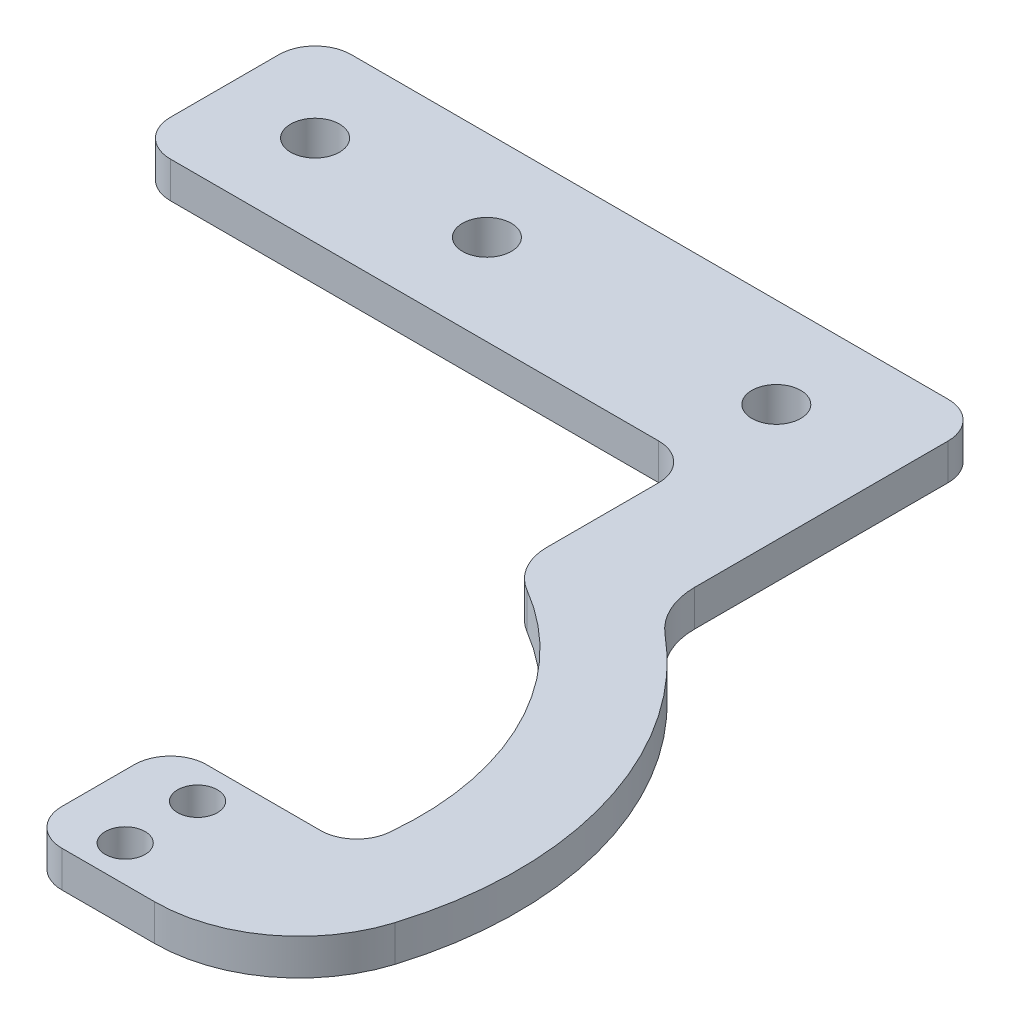
ISO-10303-21;
HEADER;
FILE_DESCRIPTION(('STEP AP214'),'2;1');
FILE_NAME('part.step','',(''),(''),'','','');
FILE_SCHEMA(('AUTOMOTIVE_DESIGN { 1 0 10303 214 1 1 1 1 }'));
ENDSEC;
DATA;
#1=APPLICATION_CONTEXT('core data for automotive mechanical design processes');
#2=APPLICATION_PROTOCOL_DEFINITION('international standard','automotive_design',2000,#1);
#3=PRODUCT_CONTEXT('',#1,'mechanical');
#4=PRODUCT('Part','Part','',(#3));
#5=PRODUCT_RELATED_PRODUCT_CATEGORY('part','',(#4));
#6=PRODUCT_DEFINITION_FORMATION('','',#4);
#7=PRODUCT_DEFINITION_CONTEXT('part definition',#1,'design');
#8=PRODUCT_DEFINITION('design','',#6,#7);
#9=PRODUCT_DEFINITION_SHAPE('','',#8);
#10=(LENGTH_UNIT() NAMED_UNIT(*) SI_UNIT(.MILLI.,.METRE.));
#11=(NAMED_UNIT(*) PLANE_ANGLE_UNIT() SI_UNIT($,.RADIAN.));
#12=(NAMED_UNIT(*) SI_UNIT($,.STERADIAN.) SOLID_ANGLE_UNIT());
#13=UNCERTAINTY_MEASURE_WITH_UNIT(LENGTH_MEASURE(1.E-05),#10,'distance_accuracy_value','');
#14=(GEOMETRIC_REPRESENTATION_CONTEXT(3) GLOBAL_UNCERTAINTY_ASSIGNED_CONTEXT((#13)) GLOBAL_UNIT_ASSIGNED_CONTEXT((#10,
#11,#12)) REPRESENTATION_CONTEXT('',''));
#15=CARTESIAN_POINT('',(0.,0.,0.));
#16=DIRECTION('',(0.,0.,1.));
#17=DIRECTION('',(1.,0.,0.));
#18=AXIS2_PLACEMENT_3D('',#15,#16,#17);
#19=CARTESIAN_POINT('',(0.,2.,0.));
#20=DIRECTION('',(0.,-1.,0.));
#21=DIRECTION('',(0.,0.,-1.));
#22=AXIS2_PLACEMENT_3D('',#19,#20,#21);
#23=PLANE('',#22);
#24=DIRECTION('',(0.,0.,1.));
#25=VECTOR('',#24,1.);
#26=CARTESIAN_POINT('',(-23.5,2.,-5.));
#27=LINE('',#26,#25);
#28=CARTESIAN_POINT('',(-23.5,2.,-3.));
#29=VERTEX_POINT('',#28);
#30=CARTESIAN_POINT('',(-23.5,2.,3.));
#31=VERTEX_POINT('',#30);
#32=EDGE_CURVE('E206',#29,#31,#27,.T.);
#33=ORIENTED_EDGE('',*,*,#32,.T.);
#34=CARTESIAN_POINT('',(-21.5,2.,3.));
#35=DIRECTION('',(0.,-1.,0.));
#36=DIRECTION('',(0.,0.,-1.));
#37=AXIS2_PLACEMENT_3D('',#34,#35,#36);
#38=CIRCLE('',#37,2.);
#39=CARTESIAN_POINT('',(-21.5,2.,5.));
#40=VERTEX_POINT('',#39);
#41=EDGE_CURVE('E266',#31,#40,#38,.F.);
#42=ORIENTED_EDGE('',*,*,#41,.T.);
#43=DIRECTION('',(1.,0.,0.));
#44=VECTOR('',#43,1.);
#45=CARTESIAN_POINT('',(-13.5,2.,5.));
#46=LINE('',#45,#44);
#47=CARTESIAN_POINT('',(5.5,2.,5.));
#48=VERTEX_POINT('',#47);
#49=EDGE_CURVE('E202',#40,#48,#46,.T.);
#50=ORIENTED_EDGE('',*,*,#49,.T.);
#51=CARTESIAN_POINT('',(5.5,2.,7.));
#52=DIRECTION('',(0.,-1.,0.));
#53=DIRECTION('',(0.,0.,-1.));
#54=AXIS2_PLACEMENT_3D('',#51,#52,#53);
#55=CIRCLE('',#54,2.);
#56=CARTESIAN_POINT('',(7.5,2.,7.));
#57=VERTEX_POINT('',#56);
#58=EDGE_CURVE('E44',#48,#57,#55,.T.);
#59=ORIENTED_EDGE('',*,*,#58,.T.);
#60=DIRECTION('',(0.,0.,1.));
#61=VECTOR('',#60,1.);
#62=CARTESIAN_POINT('',(7.5,2.,5.));
#63=LINE('',#62,#61);
#64=CARTESIAN_POINT('',(7.5,2.,13.1825021522129));
#65=VERTEX_POINT('',#64);
#66=EDGE_CURVE('E287',#57,#65,#63,.T.);
#67=ORIENTED_EDGE('',*,*,#66,.T.);
#68=CARTESIAN_POINT('',(10.5,2.,13.1825021522129));
#69=DIRECTION('',(0.,-1.,0.));
#70=DIRECTION('',(0.,0.,-1.));
#71=AXIS2_PLACEMENT_3D('',#68,#69,#70);
#72=CIRCLE('',#71,3.);
#73=CARTESIAN_POINT('',(8.98001923633249,2.,15.7689395626446));
#74=VERTEX_POINT('',#73);
#75=EDGE_CURVE('E201',#65,#74,#72,.F.);
#76=ORIENTED_EDGE('',*,*,#75,.T.);
#77=CARTESIAN_POINT('',(0.873455163439103,2.,29.5632724182805));
#78=DIRECTION('',(0.,-1.,0.));
#79=DIRECTION('',(0.,0.,1.));
#80=AXIS2_PLACEMENT_3D('',#77,#78,#79);
#81=CIRCLE('',#80,16.);
#82=CARTESIAN_POINT('',(16.7889796643267,2.,31.2052467973885));
#83=VERTEX_POINT('',#82);
#84=EDGE_CURVE('E297',#74,#83,#81,.T.);
#85=ORIENTED_EDGE('',*,*,#84,.T.);
#86=CARTESIAN_POINT('',(14.7995391017157,2.,31.));
#87=DIRECTION('',(0.,-1.,0.));
#88=DIRECTION('',(0.,0.,-1.));
#89=AXIS2_PLACEMENT_3D('',#86,#87,#88);
#90=CIRCLE('',#89,2.);
#91=CARTESIAN_POINT('',(14.7995391017157,2.,33.));
#92=VERTEX_POINT('',#91);
#93=EDGE_CURVE('E231',#83,#92,#90,.T.);
#94=ORIENTED_EDGE('',*,*,#93,.T.);
#95=DIRECTION('',(-1.,0.,0.));
#96=VECTOR('',#95,1.);
#97=CARTESIAN_POINT('',(6.5,2.,33.));
#98=LINE('',#97,#96);
#99=CARTESIAN_POINT('',(8.5,2.,33.));
#100=VERTEX_POINT('',#99);
#101=EDGE_CURVE('E367',#92,#100,#98,.T.);
#102=ORIENTED_EDGE('',*,*,#101,.T.);
#103=CARTESIAN_POINT('',(8.5,2.,35.));
#104=DIRECTION('',(0.,-1.,0.));
#105=DIRECTION('',(0.,0.,-1.));
#106=AXIS2_PLACEMENT_3D('',#103,#104,#105);
#107=CIRCLE('',#106,2.);
#108=CARTESIAN_POINT('',(6.5,2.,35.));
#109=VERTEX_POINT('',#108);
#110=EDGE_CURVE('E59',#100,#109,#107,.F.);
#111=ORIENTED_EDGE('',*,*,#110,.T.);
#112=DIRECTION('',(0.,0.,1.));
#113=VECTOR('',#112,1.);
#114=CARTESIAN_POINT('',(6.5,2.,33.));
#115=LINE('',#114,#113);
#116=CARTESIAN_POINT('',(6.5,2.,39.));
#117=VERTEX_POINT('',#116);
#118=EDGE_CURVE('E369',#109,#117,#115,.T.);
#119=ORIENTED_EDGE('',*,*,#118,.T.);
#120=CARTESIAN_POINT('',(8.5,2.,39.));
#121=DIRECTION('',(0.,-1.,0.));
#122=DIRECTION('',(0.,0.,-1.));
#123=AXIS2_PLACEMENT_3D('',#120,#121,#122);
#124=CIRCLE('',#123,2.);
#125=CARTESIAN_POINT('',(8.5,2.,41.));
#126=VERTEX_POINT('',#125);
#127=EDGE_CURVE('E51',#117,#126,#124,.F.);
#128=ORIENTED_EDGE('',*,*,#127,.T.);
#129=DIRECTION('',(1.,0.,0.));
#130=VECTOR('',#129,1.);
#131=CARTESIAN_POINT('',(6.5,2.,41.));
#132=LINE('',#131,#130);
#133=CARTESIAN_POINT('',(13.6262986506319,2.,41.));
#134=VERTEX_POINT('',#133);
#135=EDGE_CURVE('E371',#126,#134,#132,.T.);
#136=ORIENTED_EDGE('',*,*,#135,.T.);
#137=CARTESIAN_POINT('',(13.6262986506319,2.,33.));
#138=DIRECTION('',(0.,-1.,0.));
#139=DIRECTION('',(0.,0.,-1.));
#140=AXIS2_PLACEMENT_3D('',#137,#138,#139);
#141=CIRCLE('',#140,8.);
#142=CARTESIAN_POINT('',(21.2727484536269,2.,35.3519790412071));
#143=VERTEX_POINT('',#142);
#144=EDGE_CURVE('E200',#134,#143,#141,.F.);
#145=ORIENTED_EDGE('',*,*,#144,.T.);
#146=CARTESIAN_POINT('',(2.15662394613932,2.,29.4720314381894));
#147=DIRECTION('',(0.,1.,0.));
#148=DIRECTION('',(0.,0.,1.));
#149=AXIS2_PLACEMENT_3D('',#146,#147,#148);
#150=CIRCLE('',#149,20.);
#151=CARTESIAN_POINT('',(14.9427706576899,2.,14.0930050622869));
#152=VERTEX_POINT('',#151);
#153=EDGE_CURVE('E358',#143,#152,#150,.T.);
#154=ORIENTED_EDGE('',*,*,#153,.T.);
#155=CARTESIAN_POINT('',(17.5,2.,11.0171997871064));
#156=DIRECTION('',(0.,-1.,0.));
#157=DIRECTION('',(0.,0.,-1.));
#158=AXIS2_PLACEMENT_3D('',#155,#156,#157);
#159=CIRCLE('',#158,4.);
#160=CARTESIAN_POINT('',(13.5,2.,11.0171997871064));
#161=VERTEX_POINT('',#160);
#162=EDGE_CURVE('E235',#152,#161,#159,.T.);
#163=ORIENTED_EDGE('',*,*,#162,.T.);
#164=DIRECTION('',(0.,0.,-1.));
#165=VECTOR('',#164,1.);
#166=CARTESIAN_POINT('',(13.5,2.,5.));
#167=LINE('',#166,#165);
#168=CARTESIAN_POINT('',(13.5,2.,-3.));
#169=VERTEX_POINT('',#168);
#170=EDGE_CURVE('E306',#161,#169,#167,.T.);
#171=ORIENTED_EDGE('',*,*,#170,.T.);
#172=CARTESIAN_POINT('',(11.5,2.,-3.));
#173=DIRECTION('',(0.,-1.,0.));
#174=DIRECTION('',(0.,0.,-1.));
#175=AXIS2_PLACEMENT_3D('',#172,#173,#174);
#176=CIRCLE('',#175,2.);
#177=CARTESIAN_POINT('',(11.5,2.,-5.));
#178=VERTEX_POINT('',#177);
#179=EDGE_CURVE('E260',#169,#178,#176,.F.);
#180=ORIENTED_EDGE('',*,*,#179,.T.);
#181=DIRECTION('',(-1.,0.,0.));
#182=VECTOR('',#181,1.);
#183=CARTESIAN_POINT('',(-13.5,2.,-5.));
#184=LINE('',#183,#182);
#185=CARTESIAN_POINT('',(-21.5,2.,-5.));
#186=VERTEX_POINT('',#185);
#187=EDGE_CURVE('E309',#178,#186,#184,.T.);
#188=ORIENTED_EDGE('',*,*,#187,.T.);
#189=CARTESIAN_POINT('',(-21.5,2.,-3.));
#190=DIRECTION('',(0.,-1.,0.));
#191=DIRECTION('',(0.,0.,-1.));
#192=AXIS2_PLACEMENT_3D('',#189,#190,#191);
#193=CIRCLE('',#192,2.);
#194=EDGE_CURVE('E264',#186,#29,#193,.F.);
#195=ORIENTED_EDGE('',*,*,#194,.T.);
#196=EDGE_LOOP('',(#33,#42,#50,#59,#67,#76,#85,#94,#102,#111,#119,#128,#136,#145,#154,#163,#171,
#180,#188,#195));
#197=FACE_BOUND('',#196,.T.);
#198=CARTESIAN_POINT('',(7.,2.,0.));
#199=DIRECTION('',(0.,1.,0.));
#200=DIRECTION('',(0.,0.,1.));
#201=AXIS2_PLACEMENT_3D('',#198,#199,#200);
#202=CIRCLE('',#201,1.35);
#203=CARTESIAN_POINT('',(7.,2.,1.35));
#204=VERTEX_POINT('',#203);
#205=EDGE_CURVE('E321',#204,#204,#202,.T.);
#206=ORIENTED_EDGE('',*,*,#205,.F.);
#207=EDGE_LOOP('',(#206));
#208=FACE_BOUND('',#207,.T.);
#209=CARTESIAN_POINT('',(-9.,2.,0.));
#210=DIRECTION('',(0.,1.,0.));
#211=DIRECTION('',(0.,0.,-1.));
#212=AXIS2_PLACEMENT_3D('',#209,#210,#211);
#213=CIRCLE('',#212,1.35);
#214=CARTESIAN_POINT('',(-9.,2.,-1.35));
#215=VERTEX_POINT('',#214);
#216=EDGE_CURVE('E329',#215,#215,#213,.T.);
#217=ORIENTED_EDGE('',*,*,#216,.F.);
#218=EDGE_LOOP('',(#217));
#219=FACE_BOUND('',#218,.T.);
#220=CARTESIAN_POINT('',(-18.5,2.,0.));
#221=DIRECTION('',(0.,1.,0.));
#222=DIRECTION('',(0.,0.,1.));
#223=AXIS2_PLACEMENT_3D('',#220,#221,#222);
#224=CIRCLE('',#223,1.35);
#225=CARTESIAN_POINT('',(-18.5,2.,1.35));
#226=VERTEX_POINT('',#225);
#227=EDGE_CURVE('E335',#226,#226,#224,.T.);
#228=ORIENTED_EDGE('',*,*,#227,.F.);
#229=EDGE_LOOP('',(#228));
#230=FACE_BOUND('',#229,.T.);
#231=CARTESIAN_POINT('',(10.,2.,35.));
#232=DIRECTION('',(0.,1.,0.));
#233=DIRECTION('',(0.,0.,-1.));
#234=AXIS2_PLACEMENT_3D('',#231,#232,#233);
#235=CIRCLE('',#234,1.1);
#236=CARTESIAN_POINT('',(10.,2.,33.9));
#237=VERTEX_POINT('',#236);
#238=EDGE_CURVE('E298',#237,#237,#235,.T.);
#239=ORIENTED_EDGE('',*,*,#238,.F.);
#240=EDGE_LOOP('',(#239));
#241=FACE_BOUND('',#240,.T.);
#242=CARTESIAN_POINT('',(10.,2.,39.));
#243=DIRECTION('',(0.,1.,0.));
#244=DIRECTION('',(0.,0.,1.));
#245=AXIS2_PLACEMENT_3D('',#242,#243,#244);
#246=CIRCLE('',#245,1.1);
#247=CARTESIAN_POINT('',(10.,2.,40.1));
#248=VERTEX_POINT('',#247);
#249=EDGE_CURVE('E354',#248,#248,#246,.T.);
#250=ORIENTED_EDGE('',*,*,#249,.F.);
#251=EDGE_LOOP('',(#250));
#252=FACE_BOUND('',#251,.T.);
#253=ADVANCED_FACE('F36',(#197,#208,#219,#230,#241,#252),#23,.F.);
#254=CARTESIAN_POINT('',(0.,0.,0.));
#255=DIRECTION('',(0.,-1.,0.));
#256=DIRECTION('',(0.,0.,-1.));
#257=AXIS2_PLACEMENT_3D('',#254,#255,#256);
#258=PLANE('',#257);
#259=CARTESIAN_POINT('',(-9.,0.,0.));
#260=DIRECTION('',(0.,1.,0.));
#261=DIRECTION('',(0.,0.,-1.));
#262=AXIS2_PLACEMENT_3D('',#259,#260,#261);
#263=CIRCLE('',#262,1.35);
#264=CARTESIAN_POINT('',(-9.,0.,-1.35));
#265=VERTEX_POINT('',#264);
#266=EDGE_CURVE('E332',#265,#265,#263,.T.);
#267=ORIENTED_EDGE('',*,*,#266,.T.);
#268=EDGE_LOOP('',(#267));
#269=FACE_BOUND('',#268,.T.);
#270=DIRECTION('',(1.,0.,0.));
#271=VECTOR('',#270,1.);
#272=CARTESIAN_POINT('',(-13.5,0.,5.));
#273=LINE('',#272,#271);
#274=CARTESIAN_POINT('',(-21.5,0.,5.));
#275=VERTEX_POINT('',#274);
#276=CARTESIAN_POINT('',(5.5,0.,5.));
#277=VERTEX_POINT('',#276);
#278=EDGE_CURVE('E209',#275,#277,#273,.T.);
#279=ORIENTED_EDGE('',*,*,#278,.F.);
#280=CARTESIAN_POINT('',(-21.5,0.,3.));
#281=DIRECTION('',(0.,-1.,0.));
#282=DIRECTION('',(0.,0.,-1.));
#283=AXIS2_PLACEMENT_3D('',#280,#281,#282);
#284=CIRCLE('',#283,2.);
#285=CARTESIAN_POINT('',(-23.5,0.,3.));
#286=VERTEX_POINT('',#285);
#287=EDGE_CURVE('E253',#275,#286,#284,.T.);
#288=ORIENTED_EDGE('',*,*,#287,.T.);
#289=DIRECTION('',(0.,0.,1.));
#290=VECTOR('',#289,1.);
#291=CARTESIAN_POINT('',(-23.5,0.,-5.));
#292=LINE('',#291,#290);
#293=CARTESIAN_POINT('',(-23.5,0.,-3.));
#294=VERTEX_POINT('',#293);
#295=EDGE_CURVE('E307',#294,#286,#292,.T.);
#296=ORIENTED_EDGE('',*,*,#295,.F.);
#297=CARTESIAN_POINT('',(-21.5,0.,-3.));
#298=DIRECTION('',(0.,-1.,0.));
#299=DIRECTION('',(0.,0.,-1.));
#300=AXIS2_PLACEMENT_3D('',#297,#298,#299);
#301=CIRCLE('',#300,2.);
#302=CARTESIAN_POINT('',(-21.5,0.,-5.));
#303=VERTEX_POINT('',#302);
#304=EDGE_CURVE('E251',#294,#303,#301,.T.);
#305=ORIENTED_EDGE('',*,*,#304,.T.);
#306=DIRECTION('',(-1.,0.,0.));
#307=VECTOR('',#306,1.);
#308=CARTESIAN_POINT('',(-13.5,0.,-5.));
#309=LINE('',#308,#307);
#310=CARTESIAN_POINT('',(11.5,0.,-5.));
#311=VERTEX_POINT('',#310);
#312=EDGE_CURVE('E312',#311,#303,#309,.T.);
#313=ORIENTED_EDGE('',*,*,#312,.F.);
#314=CARTESIAN_POINT('',(11.5,0.,-3.));
#315=DIRECTION('',(0.,-1.,0.));
#316=DIRECTION('',(0.,0.,-1.));
#317=AXIS2_PLACEMENT_3D('',#314,#315,#316);
#318=CIRCLE('',#317,2.);
#319=CARTESIAN_POINT('',(13.5,0.,-3.));
#320=VERTEX_POINT('',#319);
#321=EDGE_CURVE('E245',#311,#320,#318,.T.);
#322=ORIENTED_EDGE('',*,*,#321,.T.);
#323=DIRECTION('',(0.,0.,-1.));
#324=VECTOR('',#323,1.);
#325=CARTESIAN_POINT('',(13.5,0.,5.));
#326=LINE('',#325,#324);
#327=CARTESIAN_POINT('',(13.5,0.,11.0171997871064));
#328=VERTEX_POINT('',#327);
#329=EDGE_CURVE('E317',#328,#320,#326,.T.);
#330=ORIENTED_EDGE('',*,*,#329,.F.);
#331=CARTESIAN_POINT('',(17.5,0.,11.0171997871064));
#332=DIRECTION('',(0.,-1.,0.));
#333=DIRECTION('',(0.,0.,-1.));
#334=AXIS2_PLACEMENT_3D('',#331,#332,#333);
#335=CIRCLE('',#334,4.);
#336=CARTESIAN_POINT('',(14.9427706576899,0.,14.0930050622869));
#337=VERTEX_POINT('',#336);
#338=EDGE_CURVE('E237',#328,#337,#335,.F.);
#339=ORIENTED_EDGE('',*,*,#338,.T.);
#340=CARTESIAN_POINT('',(2.15662394613932,0.,29.4720314381894));
#341=DIRECTION('',(0.,-1.,0.));
#342=DIRECTION('',(0.,0.,-1.));
#343=AXIS2_PLACEMENT_3D('',#340,#341,#342);
#344=CIRCLE('',#343,20.);
#345=CARTESIAN_POINT('',(21.2727484536269,0.,35.3519790412071));
#346=VERTEX_POINT('',#345);
#347=EDGE_CURVE('E184',#346,#337,#344,.F.);
#348=ORIENTED_EDGE('',*,*,#347,.F.);
#349=CARTESIAN_POINT('',(13.6262986506319,0.,33.));
#350=DIRECTION('',(0.,-1.,0.));
#351=DIRECTION('',(0.,0.,-1.));
#352=AXIS2_PLACEMENT_3D('',#349,#350,#351);
#353=CIRCLE('',#352,8.);
#354=CARTESIAN_POINT('',(13.6262986506319,0.,41.));
#355=VERTEX_POINT('',#354);
#356=EDGE_CURVE('E188',#346,#355,#353,.T.);
#357=ORIENTED_EDGE('',*,*,#356,.T.);
#358=DIRECTION('',(1.,0.,0.));
#359=VECTOR('',#358,1.);
#360=CARTESIAN_POINT('',(6.5,0.,41.));
#361=LINE('',#360,#359);
#362=CARTESIAN_POINT('',(8.5,0.,41.));
#363=VERTEX_POINT('',#362);
#364=EDGE_CURVE('E174',#363,#355,#361,.T.);
#365=ORIENTED_EDGE('',*,*,#364,.F.);
#366=CARTESIAN_POINT('',(8.5,0.,39.));
#367=DIRECTION('',(0.,-1.,0.));
#368=DIRECTION('',(0.,0.,-1.));
#369=AXIS2_PLACEMENT_3D('',#366,#367,#368);
#370=CIRCLE('',#369,2.);
#371=CARTESIAN_POINT('',(6.5,0.,39.));
#372=VERTEX_POINT('',#371);
#373=EDGE_CURVE('E247',#363,#372,#370,.T.);
#374=ORIENTED_EDGE('',*,*,#373,.T.);
#375=DIRECTION('',(0.,0.,1.));
#376=VECTOR('',#375,1.);
#377=CARTESIAN_POINT('',(6.5,0.,33.));
#378=LINE('',#377,#376);
#379=CARTESIAN_POINT('',(6.5,0.,35.));
#380=VERTEX_POINT('',#379);
#381=EDGE_CURVE('E183',#380,#372,#378,.T.);
#382=ORIENTED_EDGE('',*,*,#381,.F.);
#383=CARTESIAN_POINT('',(8.5,0.,35.));
#384=DIRECTION('',(0.,-1.,0.));
#385=DIRECTION('',(0.,0.,-1.));
#386=AXIS2_PLACEMENT_3D('',#383,#384,#385);
#387=CIRCLE('',#386,2.);
#388=CARTESIAN_POINT('',(8.5,0.,33.));
#389=VERTEX_POINT('',#388);
#390=EDGE_CURVE('E249',#380,#389,#387,.T.);
#391=ORIENTED_EDGE('',*,*,#390,.T.);
#392=DIRECTION('',(-1.,0.,0.));
#393=VECTOR('',#392,1.);
#394=CARTESIAN_POINT('',(6.5,0.,33.));
#395=LINE('',#394,#393);
#396=CARTESIAN_POINT('',(14.7995391017157,0.,33.));
#397=VERTEX_POINT('',#396);
#398=EDGE_CURVE('E347',#397,#389,#395,.T.);
#399=ORIENTED_EDGE('',*,*,#398,.F.);
#400=CARTESIAN_POINT('',(14.7995391017157,0.,31.));
#401=DIRECTION('',(0.,-1.,0.));
#402=DIRECTION('',(0.,0.,-1.));
#403=AXIS2_PLACEMENT_3D('',#400,#401,#402);
#404=CIRCLE('',#403,2.);
#405=CARTESIAN_POINT('',(16.7889796643267,0.,31.2052467973885));
#406=VERTEX_POINT('',#405);
#407=EDGE_CURVE('E233',#397,#406,#404,.F.);
#408=ORIENTED_EDGE('',*,*,#407,.T.);
#409=CARTESIAN_POINT('',(0.873455163439103,0.,29.5632724182805));
#410=DIRECTION('',(0.,-1.,0.));
#411=DIRECTION('',(0.,0.,-1.));
#412=AXIS2_PLACEMENT_3D('',#409,#410,#411);
#413=CIRCLE('',#412,16.);
#414=CARTESIAN_POINT('',(8.98001923633249,0.,15.7689395626446));
#415=VERTEX_POINT('',#414);
#416=EDGE_CURVE('E344',#415,#406,#413,.T.);
#417=ORIENTED_EDGE('',*,*,#416,.F.);
#418=CARTESIAN_POINT('',(10.5,0.,13.1825021522129));
#419=DIRECTION('',(0.,-1.,0.));
#420=DIRECTION('',(0.,0.,-1.));
#421=AXIS2_PLACEMENT_3D('',#418,#419,#420);
#422=CIRCLE('',#421,3.);
#423=CARTESIAN_POINT('',(7.5,0.,13.1825021522129));
#424=VERTEX_POINT('',#423);
#425=EDGE_CURVE('E196',#415,#424,#422,.T.);
#426=ORIENTED_EDGE('',*,*,#425,.T.);
#427=DIRECTION('',(0.,0.,1.));
#428=VECTOR('',#427,1.);
#429=CARTESIAN_POINT('',(7.5,0.,5.));
#430=LINE('',#429,#428);
#431=CARTESIAN_POINT('',(7.5,0.,7.));
#432=VERTEX_POINT('',#431);
#433=EDGE_CURVE('E302',#432,#424,#430,.T.);
#434=ORIENTED_EDGE('',*,*,#433,.F.);
#435=CARTESIAN_POINT('',(5.5,0.,7.));
#436=DIRECTION('',(0.,-1.,0.));
#437=DIRECTION('',(0.,0.,-1.));
#438=AXIS2_PLACEMENT_3D('',#435,#436,#437);
#439=CIRCLE('',#438,2.);
#440=EDGE_CURVE('E12',#432,#277,#439,.F.);
#441=ORIENTED_EDGE('',*,*,#440,.T.);
#442=EDGE_LOOP('',(#279,#288,#296,#305,#313,#322,#330,#339,#348,#357,#365,#374,#382,#391,#399,
#408,#417,#426,#434,#441));
#443=FACE_BOUND('',#442,.T.);
#444=CARTESIAN_POINT('',(7.,0.,0.));
#445=DIRECTION('',(0.,1.,0.));
#446=DIRECTION('',(0.,0.,1.));
#447=AXIS2_PLACEMENT_3D('',#444,#445,#446);
#448=CIRCLE('',#447,1.35);
#449=CARTESIAN_POINT('',(7.,0.,1.35));
#450=VERTEX_POINT('',#449);
#451=EDGE_CURVE('E326',#450,#450,#448,.T.);
#452=ORIENTED_EDGE('',*,*,#451,.T.);
#453=EDGE_LOOP('',(#452));
#454=FACE_BOUND('',#453,.T.);
#455=CARTESIAN_POINT('',(-18.5,0.,0.));
#456=DIRECTION('',(0.,1.,0.));
#457=DIRECTION('',(0.,0.,1.));
#458=AXIS2_PLACEMENT_3D('',#455,#456,#457);
#459=CIRCLE('',#458,1.35);
#460=CARTESIAN_POINT('',(-18.5,0.,1.35));
#461=VERTEX_POINT('',#460);
#462=EDGE_CURVE('E338',#461,#461,#459,.T.);
#463=ORIENTED_EDGE('',*,*,#462,.T.);
#464=EDGE_LOOP('',(#463));
#465=FACE_BOUND('',#464,.T.);
#466=CARTESIAN_POINT('',(10.,0.,35.));
#467=DIRECTION('',(0.,-1.,0.));
#468=DIRECTION('',(0.,0.,-1.));
#469=AXIS2_PLACEMENT_3D('',#466,#467,#468);
#470=CIRCLE('',#469,1.1);
#471=CARTESIAN_POINT('',(10.,0.,33.9));
#472=VERTEX_POINT('',#471);
#473=EDGE_CURVE('E355',#472,#472,#470,.F.);
#474=ORIENTED_EDGE('',*,*,#473,.T.);
#475=EDGE_LOOP('',(#474));
#476=FACE_BOUND('',#475,.T.);
#477=CARTESIAN_POINT('',(10.,0.,39.));
#478=DIRECTION('',(0.,-1.,0.));
#479=DIRECTION('',(0.,0.,-1.));
#480=AXIS2_PLACEMENT_3D('',#477,#478,#479);
#481=CIRCLE('',#480,1.1);
#482=CARTESIAN_POINT('',(10.,0.,37.9));
#483=VERTEX_POINT('',#482);
#484=EDGE_CURVE('E341',#483,#483,#481,.F.);
#485=ORIENTED_EDGE('',*,*,#484,.T.);
#486=EDGE_LOOP('',(#485));
#487=FACE_BOUND('',#486,.T.);
#488=ADVANCED_FACE('F190',(#269,#443,#454,#465,#476,#487),#258,.T.);
#489=CARTESIAN_POINT('',(13.5,2.,5.));
#490=DIRECTION('',(-1.,0.,0.));
#491=DIRECTION('',(0.,0.,1.));
#492=AXIS2_PLACEMENT_3D('',#489,#490,#491);
#493=PLANE('',#492);
#494=ORIENTED_EDGE('',*,*,#329,.T.);
#495=DIRECTION('',(0.,-1.,0.));
#496=VECTOR('',#495,1.);
#497=CARTESIAN_POINT('',(13.5,2.,-3.));
#498=LINE('',#497,#496);
#499=EDGE_CURVE('E281',#320,#169,#498,.F.);
#500=ORIENTED_EDGE('',*,*,#499,.T.);
#501=ORIENTED_EDGE('',*,*,#170,.F.);
#502=DIRECTION('',(0.,1.,0.));
#503=VECTOR('',#502,1.);
#504=CARTESIAN_POINT('',(13.5,2.,11.0171997871064));
#505=LINE('',#504,#503);
#506=EDGE_CURVE('E226',#161,#328,#505,.F.);
#507=ORIENTED_EDGE('',*,*,#506,.T.);
#508=EDGE_LOOP('',(#494,#500,#501,#507));
#509=FACE_BOUND('',#508,.T.);
#510=ADVANCED_FACE('F385',(#509),#493,.F.);
#511=CARTESIAN_POINT('',(-13.5,2.,-5.));
#512=DIRECTION('',(0.,0.,1.));
#513=DIRECTION('',(1.,0.,0.));
#514=AXIS2_PLACEMENT_3D('',#511,#512,#513);
#515=PLANE('',#514);
#516=ORIENTED_EDGE('',*,*,#312,.T.);
#517=DIRECTION('',(0.,-1.,0.));
#518=VECTOR('',#517,1.);
#519=CARTESIAN_POINT('',(-21.5,2.,-5.));
#520=LINE('',#519,#518);
#521=EDGE_CURVE('E271',#303,#186,#520,.F.);
#522=ORIENTED_EDGE('',*,*,#521,.T.);
#523=ORIENTED_EDGE('',*,*,#187,.F.);
#524=DIRECTION('',(0.,-1.,0.));
#525=VECTOR('',#524,1.);
#526=CARTESIAN_POINT('',(11.5,2.,-5.));
#527=LINE('',#526,#525);
#528=EDGE_CURVE('E268',#178,#311,#527,.T.);
#529=ORIENTED_EDGE('',*,*,#528,.T.);
#530=EDGE_LOOP('',(#516,#522,#523,#529));
#531=FACE_BOUND('',#530,.T.);
#532=ADVANCED_FACE('F394',(#531),#515,.F.);
#533=CARTESIAN_POINT('',(-23.5,2.,-5.));
#534=DIRECTION('',(1.,0.,0.));
#535=DIRECTION('',(0.,0.,-1.));
#536=AXIS2_PLACEMENT_3D('',#533,#534,#535);
#537=PLANE('',#536);
#538=ORIENTED_EDGE('',*,*,#295,.T.);
#539=DIRECTION('',(0.,-1.,0.));
#540=VECTOR('',#539,1.);
#541=CARTESIAN_POINT('',(-23.5,2.,3.));
#542=LINE('',#541,#540);
#543=EDGE_CURVE('E258',#286,#31,#542,.F.);
#544=ORIENTED_EDGE('',*,*,#543,.T.);
#545=ORIENTED_EDGE('',*,*,#32,.F.);
#546=DIRECTION('',(0.,-1.,0.));
#547=VECTOR('',#546,1.);
#548=CARTESIAN_POINT('',(-23.5,2.,-3.));
#549=LINE('',#548,#547);
#550=EDGE_CURVE('E255',#29,#294,#549,.T.);
#551=ORIENTED_EDGE('',*,*,#550,.T.);
#552=EDGE_LOOP('',(#538,#544,#545,#551));
#553=FACE_BOUND('',#552,.T.);
#554=ADVANCED_FACE('F401',(#553),#537,.F.);
#555=CARTESIAN_POINT('',(-13.5,2.,5.));
#556=DIRECTION('',(0.,0.,-1.));
#557=DIRECTION('',(-1.,0.,0.));
#558=AXIS2_PLACEMENT_3D('',#555,#556,#557);
#559=PLANE('',#558);
#560=ORIENTED_EDGE('',*,*,#49,.F.);
#561=DIRECTION('',(0.,-1.,0.));
#562=VECTOR('',#561,1.);
#563=CARTESIAN_POINT('',(-21.5,2.,5.));
#564=LINE('',#563,#562);
#565=EDGE_CURVE('E242',#40,#275,#564,.T.);
#566=ORIENTED_EDGE('',*,*,#565,.T.);
#567=ORIENTED_EDGE('',*,*,#278,.T.);
#568=DIRECTION('',(0.,1.,0.));
#569=VECTOR('',#568,1.);
#570=CARTESIAN_POINT('',(5.5,2.,5.));
#571=LINE('',#570,#569);
#572=EDGE_CURVE('E239',#277,#48,#571,.T.);
#573=ORIENTED_EDGE('',*,*,#572,.T.);
#574=EDGE_LOOP('',(#560,#566,#567,#573));
#575=FACE_BOUND('',#574,.T.);
#576=ADVANCED_FACE('F304',(#575),#559,.F.);
#577=CARTESIAN_POINT('',(7.,2.,0.));
#578=DIRECTION('',(0.,-1.,0.));
#579=DIRECTION('',(0.,0.,-1.));
#580=AXIS2_PLACEMENT_3D('',#577,#578,#579);
#581=CYLINDRICAL_SURFACE('',#580,1.35);
#582=ORIENTED_EDGE('',*,*,#205,.T.);
#583=EDGE_LOOP('',(#582));
#584=FACE_BOUND('',#583,.T.);
#585=ORIENTED_EDGE('',*,*,#451,.F.);
#586=EDGE_LOOP('',(#585));
#587=FACE_BOUND('',#586,.T.);
#588=ADVANCED_FACE('F424',(#584,#587),#581,.F.);
#589=CARTESIAN_POINT('',(-9.,2.,0.));
#590=DIRECTION('',(0.,-1.,0.));
#591=DIRECTION('',(0.,0.,-1.));
#592=AXIS2_PLACEMENT_3D('',#589,#590,#591);
#593=CYLINDRICAL_SURFACE('',#592,1.35);
#594=ORIENTED_EDGE('',*,*,#216,.T.);
#595=EDGE_LOOP('',(#594));
#596=FACE_BOUND('',#595,.T.);
#597=ORIENTED_EDGE('',*,*,#266,.F.);
#598=EDGE_LOOP('',(#597));
#599=FACE_BOUND('',#598,.T.);
#600=ADVANCED_FACE('F608',(#596,#599),#593,.F.);
#601=CARTESIAN_POINT('',(-18.5,2.,0.));
#602=DIRECTION('',(0.,-1.,0.));
#603=DIRECTION('',(0.,0.,-1.));
#604=AXIS2_PLACEMENT_3D('',#601,#602,#603);
#605=CYLINDRICAL_SURFACE('',#604,1.35);
#606=ORIENTED_EDGE('',*,*,#227,.T.);
#607=EDGE_LOOP('',(#606));
#608=FACE_BOUND('',#607,.T.);
#609=ORIENTED_EDGE('',*,*,#462,.F.);
#610=EDGE_LOOP('',(#609));
#611=FACE_BOUND('',#610,.T.);
#612=ADVANCED_FACE('F601',(#608,#611),#605,.F.);
#613=CARTESIAN_POINT('',(2.15662394613932,-39.2572270211591,29.4720314381894));
#614=DIRECTION('',(0.,1.,0.));
#615=DIRECTION('',(0.,0.,1.));
#616=AXIS2_PLACEMENT_3D('',#613,#614,#615);
#617=CYLINDRICAL_SURFACE('',#616,20.);
#618=ORIENTED_EDGE('',*,*,#153,.F.);
#619=DIRECTION('',(0.,1.,0.));
#620=VECTOR('',#619,1.);
#621=CARTESIAN_POINT('',(21.2727484536269,-39.2572270211591,35.3519790412071));
#622=LINE('',#621,#620);
#623=EDGE_CURVE('E216',#143,#346,#622,.F.);
#624=ORIENTED_EDGE('',*,*,#623,.T.);
#625=ORIENTED_EDGE('',*,*,#347,.T.);
#626=DIRECTION('',(0.,1.,0.));
#627=VECTOR('',#626,1.);
#628=CARTESIAN_POINT('',(14.9427706576899,-39.2572270211591,14.0930050622869));
#629=LINE('',#628,#627);
#630=EDGE_CURVE('E213',#337,#152,#629,.T.);
#631=ORIENTED_EDGE('',*,*,#630,.T.);
#632=EDGE_LOOP('',(#618,#624,#625,#631));
#633=FACE_BOUND('',#632,.T.);
#634=ADVANCED_FACE('F377',(#633),#617,.T.);
#635=CARTESIAN_POINT('',(6.5,-39.2572270211591,41.));
#636=DIRECTION('',(0.,0.,1.));
#637=DIRECTION('',(1.,0.,0.));
#638=AXIS2_PLACEMENT_3D('',#635,#636,#637);
#639=PLANE('',#638);
#640=ORIENTED_EDGE('',*,*,#135,.F.);
#641=DIRECTION('',(0.,1.,0.));
#642=VECTOR('',#641,1.);
#643=CARTESIAN_POINT('',(8.5,-39.2572270211591,41.));
#644=LINE('',#643,#642);
#645=EDGE_CURVE('E180',#126,#363,#644,.F.);
#646=ORIENTED_EDGE('',*,*,#645,.T.);
#647=ORIENTED_EDGE('',*,*,#364,.T.);
#648=DIRECTION('',(0.,1.,0.));
#649=VECTOR('',#648,1.);
#650=CARTESIAN_POINT('',(13.6262986506319,-39.2572270211591,41.));
#651=LINE('',#650,#649);
#652=EDGE_CURVE('E179',#355,#134,#651,.T.);
#653=ORIENTED_EDGE('',*,*,#652,.T.);
#654=EDGE_LOOP('',(#640,#646,#647,#653));
#655=FACE_BOUND('',#654,.T.);
#656=ADVANCED_FACE('F177',(#655),#639,.T.);
#657=CARTESIAN_POINT('',(6.5,-39.2572270211591,33.));
#658=DIRECTION('',(-1.,0.,0.));
#659=DIRECTION('',(0.,0.,1.));
#660=AXIS2_PLACEMENT_3D('',#657,#658,#659);
#661=PLANE('',#660);
#662=ORIENTED_EDGE('',*,*,#118,.F.);
#663=DIRECTION('',(0.,1.,0.));
#664=VECTOR('',#663,1.);
#665=CARTESIAN_POINT('',(6.5,-39.2572270211591,35.));
#666=LINE('',#665,#664);
#667=EDGE_CURVE('E278',#109,#380,#666,.F.);
#668=ORIENTED_EDGE('',*,*,#667,.T.);
#669=ORIENTED_EDGE('',*,*,#381,.T.);
#670=DIRECTION('',(0.,1.,0.));
#671=VECTOR('',#670,1.);
#672=CARTESIAN_POINT('',(6.5,-39.2572270211591,39.));
#673=LINE('',#672,#671);
#674=EDGE_CURVE('E276',#372,#117,#673,.T.);
#675=ORIENTED_EDGE('',*,*,#674,.T.);
#676=EDGE_LOOP('',(#662,#668,#669,#675));
#677=FACE_BOUND('',#676,.T.);
#678=ADVANCED_FACE('F503',(#677),#661,.T.);
#679=CARTESIAN_POINT('',(6.5,-39.2572270211591,33.));
#680=DIRECTION('',(0.,0.,-1.));
#681=DIRECTION('',(-1.,0.,0.));
#682=AXIS2_PLACEMENT_3D('',#679,#680,#681);
#683=PLANE('',#682);
#684=ORIENTED_EDGE('',*,*,#398,.T.);
#685=DIRECTION('',(0.,1.,0.));
#686=VECTOR('',#685,1.);
#687=CARTESIAN_POINT('',(8.5,-39.2572270211591,33.));
#688=LINE('',#687,#686);
#689=EDGE_CURVE('E273',#389,#100,#688,.T.);
#690=ORIENTED_EDGE('',*,*,#689,.T.);
#691=ORIENTED_EDGE('',*,*,#101,.F.);
#692=DIRECTION('',(0.,-1.,0.));
#693=VECTOR('',#692,1.);
#694=CARTESIAN_POINT('',(14.7995391017157,0.,33.));
#695=LINE('',#694,#693);
#696=EDGE_CURVE('E224',#92,#397,#695,.T.);
#697=ORIENTED_EDGE('',*,*,#696,.T.);
#698=EDGE_LOOP('',(#684,#690,#691,#697));
#699=FACE_BOUND('',#698,.T.);
#700=ADVANCED_FACE('F513',(#699),#683,.T.);
#701=CARTESIAN_POINT('',(0.873455163439103,-39.2572270211591,29.5632724182805));
#702=DIRECTION('',(0.,1.,0.));
#703=DIRECTION('',(0.,0.,1.));
#704=AXIS2_PLACEMENT_3D('',#701,#702,#703);
#705=CYLINDRICAL_SURFACE('',#704,16.);
#706=ORIENTED_EDGE('',*,*,#416,.T.);
#707=DIRECTION('',(0.,1.,0.));
#708=VECTOR('',#707,1.);
#709=CARTESIAN_POINT('',(16.7889796643267,-39.2572270211591,31.2052467973885));
#710=LINE('',#709,#708);
#711=EDGE_CURVE('E221',#406,#83,#710,.T.);
#712=ORIENTED_EDGE('',*,*,#711,.T.);
#713=ORIENTED_EDGE('',*,*,#84,.F.);
#714=DIRECTION('',(0.,1.,0.));
#715=VECTOR('',#714,1.);
#716=CARTESIAN_POINT('',(8.98001923633249,-39.2572270211591,15.7689395626446));
#717=LINE('',#716,#715);
#718=EDGE_CURVE('E195',#74,#415,#717,.F.);
#719=ORIENTED_EDGE('',*,*,#718,.T.);
#720=EDGE_LOOP('',(#706,#712,#713,#719));
#721=FACE_BOUND('',#720,.T.);
#722=ADVANCED_FACE('F523',(#721),#705,.F.);
#723=CARTESIAN_POINT('',(7.5,-39.2572270211591,5.));
#724=DIRECTION('',(-1.,0.,0.));
#725=DIRECTION('',(0.,0.,1.));
#726=AXIS2_PLACEMENT_3D('',#723,#724,#725);
#727=PLANE('',#726);
#728=ORIENTED_EDGE('',*,*,#66,.F.);
#729=DIRECTION('',(0.,1.,0.));
#730=VECTOR('',#729,1.);
#731=CARTESIAN_POINT('',(7.5,-39.2572270211591,7.));
#732=LINE('',#731,#730);
#733=EDGE_CURVE('E283',#57,#432,#732,.F.);
#734=ORIENTED_EDGE('',*,*,#733,.T.);
#735=ORIENTED_EDGE('',*,*,#433,.T.);
#736=DIRECTION('',(0.,1.,0.));
#737=VECTOR('',#736,1.);
#738=CARTESIAN_POINT('',(7.5,-39.2572270211591,13.1825021522129));
#739=LINE('',#738,#737);
#740=EDGE_CURVE('E228',#424,#65,#739,.T.);
#741=ORIENTED_EDGE('',*,*,#740,.T.);
#742=EDGE_LOOP('',(#728,#734,#735,#741));
#743=FACE_BOUND('',#742,.T.);
#744=ADVANCED_FACE('F294',(#743),#727,.T.);
#745=CARTESIAN_POINT('',(10.,-39.2572270211591,39.));
#746=DIRECTION('',(0.,1.,0.));
#747=DIRECTION('',(0.,0.,1.));
#748=AXIS2_PLACEMENT_3D('',#745,#746,#747);
#749=CYLINDRICAL_SURFACE('',#748,1.1);
#750=ORIENTED_EDGE('',*,*,#249,.T.);
#751=EDGE_LOOP('',(#750));
#752=FACE_BOUND('',#751,.T.);
#753=ORIENTED_EDGE('',*,*,#484,.F.);
#754=EDGE_LOOP('',(#753));
#755=FACE_BOUND('',#754,.T.);
#756=ADVANCED_FACE('F534',(#752,#755),#749,.F.);
#757=CARTESIAN_POINT('',(10.,-39.2572270211591,35.));
#758=DIRECTION('',(0.,1.,0.));
#759=DIRECTION('',(0.,0.,1.));
#760=AXIS2_PLACEMENT_3D('',#757,#758,#759);
#761=CYLINDRICAL_SURFACE('',#760,1.1);
#762=ORIENTED_EDGE('',*,*,#238,.T.);
#763=EDGE_LOOP('',(#762));
#764=FACE_BOUND('',#763,.T.);
#765=ORIENTED_EDGE('',*,*,#473,.F.);
#766=EDGE_LOOP('',(#765));
#767=FACE_BOUND('',#766,.T.);
#768=ADVANCED_FACE('F438',(#764,#767),#761,.F.);
#769=CARTESIAN_POINT('',(13.6262986506319,-39.2572270211591,33.));
#770=DIRECTION('',(0.,1.,0.));
#771=DIRECTION('',(0.,0.,1.));
#772=AXIS2_PLACEMENT_3D('',#769,#770,#771);
#773=CYLINDRICAL_SURFACE('',#772,8.);
#774=ORIENTED_EDGE('',*,*,#356,.F.);
#775=ORIENTED_EDGE('',*,*,#623,.F.);
#776=ORIENTED_EDGE('',*,*,#144,.F.);
#777=ORIENTED_EDGE('',*,*,#652,.F.);
#778=EDGE_LOOP('',(#774,#775,#776,#777));
#779=FACE_BOUND('',#778,.T.);
#780=ADVANCED_FACE('F199',(#779),#773,.T.);
#781=CARTESIAN_POINT('',(14.7995391017157,-39.2572270211591,31.));
#782=DIRECTION('',(0.,1.,0.));
#783=DIRECTION('',(0.,0.,1.));
#784=AXIS2_PLACEMENT_3D('',#781,#782,#783);
#785=CYLINDRICAL_SURFACE('',#784,2.);
#786=ORIENTED_EDGE('',*,*,#407,.F.);
#787=ORIENTED_EDGE('',*,*,#696,.F.);
#788=ORIENTED_EDGE('',*,*,#93,.F.);
#789=ORIENTED_EDGE('',*,*,#711,.F.);
#790=EDGE_LOOP('',(#786,#787,#788,#789));
#791=FACE_BOUND('',#790,.T.);
#792=ADVANCED_FACE('F437',(#791),#785,.F.);
#793=CARTESIAN_POINT('',(17.5,-39.2572270211591,11.0171997871064));
#794=DIRECTION('',(0.,1.,0.));
#795=DIRECTION('',(0.,0.,1.));
#796=AXIS2_PLACEMENT_3D('',#793,#794,#795);
#797=CYLINDRICAL_SURFACE('',#796,4.);
#798=ORIENTED_EDGE('',*,*,#338,.F.);
#799=ORIENTED_EDGE('',*,*,#506,.F.);
#800=ORIENTED_EDGE('',*,*,#162,.F.);
#801=ORIENTED_EDGE('',*,*,#630,.F.);
#802=EDGE_LOOP('',(#798,#799,#800,#801));
#803=FACE_BOUND('',#802,.T.);
#804=ADVANCED_FACE('F381',(#803),#797,.F.);
#805=CARTESIAN_POINT('',(10.5,-39.2572270211591,13.1825021522129));
#806=DIRECTION('',(0.,1.,0.));
#807=DIRECTION('',(0.,0.,1.));
#808=AXIS2_PLACEMENT_3D('',#805,#806,#807);
#809=CYLINDRICAL_SURFACE('',#808,3.);
#810=ORIENTED_EDGE('',*,*,#425,.F.);
#811=ORIENTED_EDGE('',*,*,#718,.F.);
#812=ORIENTED_EDGE('',*,*,#75,.F.);
#813=ORIENTED_EDGE('',*,*,#740,.F.);
#814=EDGE_LOOP('',(#810,#811,#812,#813));
#815=FACE_BOUND('',#814,.T.);
#816=ADVANCED_FACE('F406',(#815),#809,.T.);
#817=CARTESIAN_POINT('',(-21.5,2.,3.));
#818=DIRECTION('',(0.,-1.,0.));
#819=DIRECTION('',(0.,0.,-1.));
#820=AXIS2_PLACEMENT_3D('',#817,#818,#819);
#821=CYLINDRICAL_SURFACE('',#820,2.);
#822=ORIENTED_EDGE('',*,*,#41,.F.);
#823=ORIENTED_EDGE('',*,*,#543,.F.);
#824=ORIENTED_EDGE('',*,*,#287,.F.);
#825=ORIENTED_EDGE('',*,*,#565,.F.);
#826=EDGE_LOOP('',(#822,#823,#824,#825));
#827=FACE_BOUND('',#826,.T.);
#828=ADVANCED_FACE('F404',(#827),#821,.T.);
#829=CARTESIAN_POINT('',(-21.5,2.,-3.));
#830=DIRECTION('',(0.,-1.,0.));
#831=DIRECTION('',(0.,0.,-1.));
#832=AXIS2_PLACEMENT_3D('',#829,#830,#831);
#833=CYLINDRICAL_SURFACE('',#832,2.);
#834=ORIENTED_EDGE('',*,*,#194,.F.);
#835=ORIENTED_EDGE('',*,*,#521,.F.);
#836=ORIENTED_EDGE('',*,*,#304,.F.);
#837=ORIENTED_EDGE('',*,*,#550,.F.);
#838=EDGE_LOOP('',(#834,#835,#836,#837));
#839=FACE_BOUND('',#838,.T.);
#840=ADVANCED_FACE('F400',(#839),#833,.T.);
#841=CARTESIAN_POINT('',(8.5,-39.2572270211591,35.));
#842=DIRECTION('',(0.,1.,0.));
#843=DIRECTION('',(0.,0.,1.));
#844=AXIS2_PLACEMENT_3D('',#841,#842,#843);
#845=CYLINDRICAL_SURFACE('',#844,2.);
#846=ORIENTED_EDGE('',*,*,#390,.F.);
#847=ORIENTED_EDGE('',*,*,#667,.F.);
#848=ORIENTED_EDGE('',*,*,#110,.F.);
#849=ORIENTED_EDGE('',*,*,#689,.F.);
#850=EDGE_LOOP('',(#846,#847,#848,#849));
#851=FACE_BOUND('',#850,.T.);
#852=ADVANCED_FACE('F412',(#851),#845,.T.);
#853=CARTESIAN_POINT('',(8.5,-39.2572270211591,39.));
#854=DIRECTION('',(0.,1.,0.));
#855=DIRECTION('',(0.,0.,1.));
#856=AXIS2_PLACEMENT_3D('',#853,#854,#855);
#857=CYLINDRICAL_SURFACE('',#856,2.);
#858=ORIENTED_EDGE('',*,*,#373,.F.);
#859=ORIENTED_EDGE('',*,*,#645,.F.);
#860=ORIENTED_EDGE('',*,*,#127,.F.);
#861=ORIENTED_EDGE('',*,*,#674,.F.);
#862=EDGE_LOOP('',(#858,#859,#860,#861));
#863=FACE_BOUND('',#862,.T.);
#864=ADVANCED_FACE('F555',(#863),#857,.T.);
#865=CARTESIAN_POINT('',(11.5,2.,-3.));
#866=DIRECTION('',(0.,-1.,0.));
#867=DIRECTION('',(0.,0.,-1.));
#868=AXIS2_PLACEMENT_3D('',#865,#866,#867);
#869=CYLINDRICAL_SURFACE('',#868,2.);
#870=ORIENTED_EDGE('',*,*,#179,.F.);
#871=ORIENTED_EDGE('',*,*,#499,.F.);
#872=ORIENTED_EDGE('',*,*,#321,.F.);
#873=ORIENTED_EDGE('',*,*,#528,.F.);
#874=EDGE_LOOP('',(#870,#871,#872,#873));
#875=FACE_BOUND('',#874,.T.);
#876=ADVANCED_FACE('F391',(#875),#869,.T.);
#877=CARTESIAN_POINT('',(5.5,2.,7.));
#878=DIRECTION('',(0.,1.,0.));
#879=DIRECTION('',(0.,0.,1.));
#880=AXIS2_PLACEMENT_3D('',#877,#878,#879);
#881=CYLINDRICAL_SURFACE('',#880,2.);
#882=ORIENTED_EDGE('',*,*,#440,.F.);
#883=ORIENTED_EDGE('',*,*,#733,.F.);
#884=ORIENTED_EDGE('',*,*,#58,.F.);
#885=ORIENTED_EDGE('',*,*,#572,.F.);
#886=EDGE_LOOP('',(#882,#883,#884,#885));
#887=FACE_BOUND('',#886,.T.);
#888=ADVANCED_FACE('F38',(#887),#881,.F.);
#889=CLOSED_SHELL('',(#253,#488,#510,#532,#554,#576,#588,#600,#612,#634,#656,#678,#700,#722,
#744,#756,#768,#780,#792,#804,#816,#828,#840,#852,#864,#876,#888));
#890=MANIFOLD_SOLID_BREP('B2',#889);
#891=ADVANCED_BREP_SHAPE_REPRESENTATION('',(#18,#890),#14);
#892=SHAPE_DEFINITION_REPRESENTATION(#9,#891);
ENDSEC;
END-ISO-10303-21;
